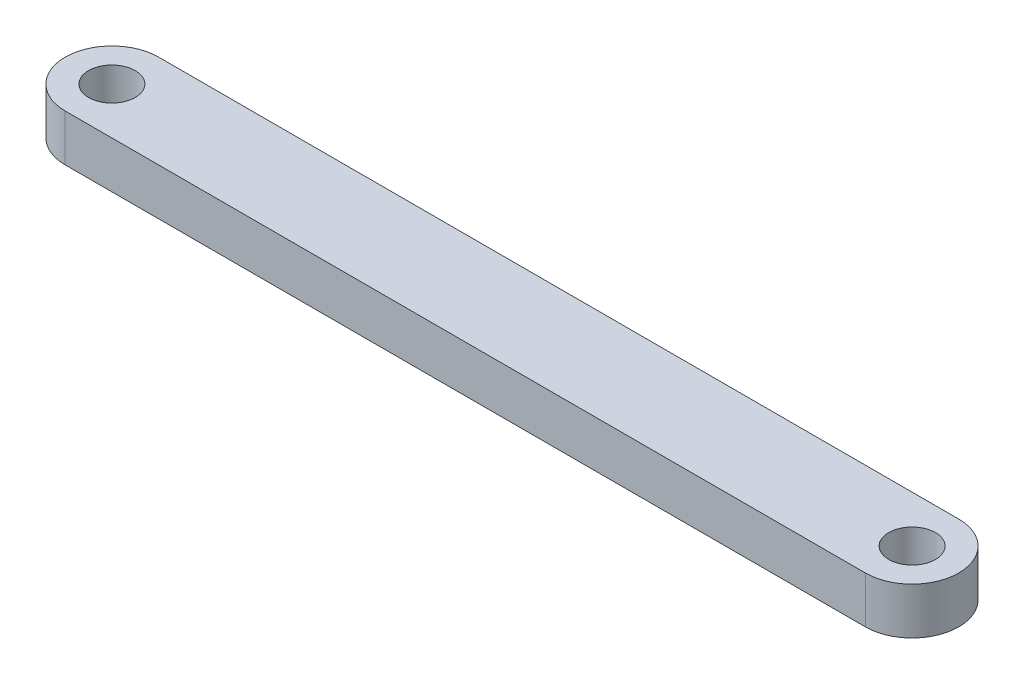
ISO-10303-21;
HEADER;
FILE_DESCRIPTION(('STEP AP214'),'2;1');
FILE_NAME('part.step','',(''),(''),'','','');
FILE_SCHEMA(('AUTOMOTIVE_DESIGN { 1 0 10303 214 1 1 1 1 }'));
ENDSEC;
DATA;
#1=APPLICATION_CONTEXT('core data for automotive mechanical design processes');
#2=APPLICATION_PROTOCOL_DEFINITION('international standard','automotive_design',2000,#1);
#3=PRODUCT_CONTEXT('',#1,'mechanical');
#4=PRODUCT('Part','Part','',(#3));
#5=PRODUCT_RELATED_PRODUCT_CATEGORY('part','',(#4));
#6=PRODUCT_DEFINITION_FORMATION('','',#4);
#7=PRODUCT_DEFINITION_CONTEXT('part definition',#1,'design');
#8=PRODUCT_DEFINITION('design','',#6,#7);
#9=PRODUCT_DEFINITION_SHAPE('','',#8);
#10=(LENGTH_UNIT() NAMED_UNIT(*) SI_UNIT(.MILLI.,.METRE.));
#11=(NAMED_UNIT(*) PLANE_ANGLE_UNIT() SI_UNIT($,.RADIAN.));
#12=(NAMED_UNIT(*) SI_UNIT($,.STERADIAN.) SOLID_ANGLE_UNIT());
#13=UNCERTAINTY_MEASURE_WITH_UNIT(LENGTH_MEASURE(1.E-05),#10,'distance_accuracy_value','');
#14=(GEOMETRIC_REPRESENTATION_CONTEXT(3) GLOBAL_UNCERTAINTY_ASSIGNED_CONTEXT((#13)) GLOBAL_UNIT_ASSIGNED_CONTEXT((#10,
#11,#12)) REPRESENTATION_CONTEXT('',''));
#15=CARTESIAN_POINT('',(0.,0.,0.));
#16=DIRECTION('',(0.,0.,1.));
#17=DIRECTION('',(1.,0.,0.));
#18=AXIS2_PLACEMENT_3D('',#15,#16,#17);
#19=CARTESIAN_POINT('',(-17.14,2.,0.));
#20=DIRECTION('',(0.,1.,0.));
#21=DIRECTION('',(0.,0.,1.));
#22=AXIS2_PLACEMENT_3D('',#19,#20,#21);
#23=PLANE('',#22);
#24=CARTESIAN_POINT('',(-17.14,2.,0.));
#25=DIRECTION('',(0.,1.,0.));
#26=DIRECTION('',(0.,0.,1.));
#27=AXIS2_PLACEMENT_3D('',#24,#25,#26);
#28=CIRCLE('',#27,1.);
#29=CARTESIAN_POINT('',(-17.14,2.,1.));
#30=VERTEX_POINT('',#29);
#31=EDGE_CURVE('E108',#30,#30,#28,.T.);
#32=ORIENTED_EDGE('',*,*,#31,.F.);
#33=EDGE_LOOP('',(#32));
#34=FACE_BOUND('',#33,.T.);
#35=CARTESIAN_POINT('',(-17.14,2.,0.));
#36=DIRECTION('',(0.,1.,0.));
#37=DIRECTION('',(0.,0.,1.));
#38=AXIS2_PLACEMENT_3D('',#35,#36,#37);
#39=CIRCLE('',#38,2.);
#40=CARTESIAN_POINT('',(-17.14,2.,-2.));
#41=VERTEX_POINT('',#40);
#42=CARTESIAN_POINT('',(-17.14,2.,2.00000000000001));
#43=VERTEX_POINT('',#42);
#44=EDGE_CURVE('E93',#41,#43,#39,.T.);
#45=ORIENTED_EDGE('',*,*,#44,.T.);
#46=DIRECTION('',(1.,0.,0.));
#47=VECTOR('',#46,1.);
#48=CARTESIAN_POINT('',(17.14,2.,2.));
#49=LINE('',#48,#47);
#50=CARTESIAN_POINT('',(17.14,2.,2.));
#51=VERTEX_POINT('',#50);
#52=EDGE_CURVE('E88',#43,#51,#49,.T.);
#53=ORIENTED_EDGE('',*,*,#52,.T.);
#54=CARTESIAN_POINT('',(17.14,2.,0.));
#55=DIRECTION('',(0.,1.,0.));
#56=DIRECTION('',(0.,0.,1.));
#57=AXIS2_PLACEMENT_3D('',#54,#55,#56);
#58=CIRCLE('',#57,2.);
#59=CARTESIAN_POINT('',(17.14,2.,-2.));
#60=VERTEX_POINT('',#59);
#61=EDGE_CURVE('E91',#51,#60,#58,.T.);
#62=ORIENTED_EDGE('',*,*,#61,.T.);
#63=DIRECTION('',(-1.,0.,0.));
#64=VECTOR('',#63,1.);
#65=CARTESIAN_POINT('',(-17.14,2.,-2.));
#66=LINE('',#65,#64);
#67=EDGE_CURVE('E58',#60,#41,#66,.T.);
#68=ORIENTED_EDGE('',*,*,#67,.T.);
#69=EDGE_LOOP('',(#45,#53,#62,#68));
#70=FACE_BOUND('',#69,.T.);
#71=CARTESIAN_POINT('',(17.14,2.,0.));
#72=DIRECTION('',(0.,1.,0.));
#73=DIRECTION('',(0.,0.,1.));
#74=AXIS2_PLACEMENT_3D('',#71,#72,#73);
#75=CIRCLE('',#74,1.);
#76=CARTESIAN_POINT('',(17.14,2.,1.));
#77=VERTEX_POINT('',#76);
#78=EDGE_CURVE('E123',#77,#77,#75,.T.);
#79=ORIENTED_EDGE('',*,*,#78,.F.);
#80=EDGE_LOOP('',(#79));
#81=FACE_BOUND('',#80,.T.);
#82=ADVANCED_FACE('F41',(#34,#70,#81),#23,.T.);
#83=CARTESIAN_POINT('',(-17.14,0.,0.));
#84=DIRECTION('',(0.,1.,0.));
#85=DIRECTION('',(0.,0.,1.));
#86=AXIS2_PLACEMENT_3D('',#83,#84,#85);
#87=PLANE('',#86);
#88=CARTESIAN_POINT('',(-17.14,0.,0.));
#89=DIRECTION('',(0.,1.,0.));
#90=DIRECTION('',(0.,0.,1.));
#91=AXIS2_PLACEMENT_3D('',#88,#89,#90);
#92=CIRCLE('',#91,2.);
#93=CARTESIAN_POINT('',(-17.14,0.,-2.));
#94=VERTEX_POINT('',#93);
#95=CARTESIAN_POINT('',(-17.14,0.,2.00000000000001));
#96=VERTEX_POINT('',#95);
#97=EDGE_CURVE('E105',#94,#96,#92,.T.);
#98=ORIENTED_EDGE('',*,*,#97,.F.);
#99=DIRECTION('',(-1.,0.,0.));
#100=VECTOR('',#99,1.);
#101=CARTESIAN_POINT('',(-17.14,0.,-2.));
#102=LINE('',#101,#100);
#103=CARTESIAN_POINT('',(17.14,0.,-2.));
#104=VERTEX_POINT('',#103);
#105=EDGE_CURVE('E81',#104,#94,#102,.T.);
#106=ORIENTED_EDGE('',*,*,#105,.F.);
#107=CARTESIAN_POINT('',(17.14,0.,0.));
#108=DIRECTION('',(0.,1.,0.));
#109=DIRECTION('',(0.,0.,1.));
#110=AXIS2_PLACEMENT_3D('',#107,#108,#109);
#111=CIRCLE('',#110,2.);
#112=CARTESIAN_POINT('',(17.14,0.,2.));
#113=VERTEX_POINT('',#112);
#114=EDGE_CURVE('E75',#113,#104,#111,.T.);
#115=ORIENTED_EDGE('',*,*,#114,.F.);
#116=DIRECTION('',(1.,0.,0.));
#117=VECTOR('',#116,1.);
#118=CARTESIAN_POINT('',(17.14,0.,2.));
#119=LINE('',#118,#117);
#120=EDGE_CURVE('E97',#96,#113,#119,.T.);
#121=ORIENTED_EDGE('',*,*,#120,.F.);
#122=EDGE_LOOP('',(#98,#106,#115,#121));
#123=FACE_BOUND('',#122,.T.);
#124=CARTESIAN_POINT('',(-17.14,0.,0.));
#125=DIRECTION('',(0.,1.,0.));
#126=DIRECTION('',(0.,0.,1.));
#127=AXIS2_PLACEMENT_3D('',#124,#125,#126);
#128=CIRCLE('',#127,1.);
#129=CARTESIAN_POINT('',(-17.14,0.,1.));
#130=VERTEX_POINT('',#129);
#131=EDGE_CURVE('E120',#130,#130,#128,.T.);
#132=ORIENTED_EDGE('',*,*,#131,.T.);
#133=EDGE_LOOP('',(#132));
#134=FACE_BOUND('',#133,.T.);
#135=CARTESIAN_POINT('',(17.14,0.,0.));
#136=DIRECTION('',(0.,1.,0.));
#137=DIRECTION('',(0.,0.,1.));
#138=AXIS2_PLACEMENT_3D('',#135,#136,#137);
#139=CIRCLE('',#138,1.);
#140=CARTESIAN_POINT('',(17.14,0.,1.));
#141=VERTEX_POINT('',#140);
#142=EDGE_CURVE('E126',#141,#141,#139,.T.);
#143=ORIENTED_EDGE('',*,*,#142,.T.);
#144=EDGE_LOOP('',(#143));
#145=FACE_BOUND('',#144,.T.);
#146=ADVANCED_FACE('F116',(#123,#134,#145),#87,.F.);
#147=CARTESIAN_POINT('',(-17.14,2.,0.));
#148=DIRECTION('',(0.,-1.,0.));
#149=DIRECTION('',(0.,0.,-1.));
#150=AXIS2_PLACEMENT_3D('',#147,#148,#149);
#151=CYLINDRICAL_SURFACE('',#150,2.);
#152=ORIENTED_EDGE('',*,*,#97,.T.);
#153=DIRECTION('',(0.,-1.,0.));
#154=VECTOR('',#153,1.);
#155=CARTESIAN_POINT('',(-17.14,2.,2.00000000000001));
#156=LINE('',#155,#154);
#157=EDGE_CURVE('E11',#43,#96,#156,.T.);
#158=ORIENTED_EDGE('',*,*,#157,.F.);
#159=ORIENTED_EDGE('',*,*,#44,.F.);
#160=DIRECTION('',(0.,-1.,0.));
#161=VECTOR('',#160,1.);
#162=CARTESIAN_POINT('',(-17.14,2.,-2.));
#163=LINE('',#162,#161);
#164=EDGE_CURVE('E101',#41,#94,#163,.T.);
#165=ORIENTED_EDGE('',*,*,#164,.T.);
#166=EDGE_LOOP('',(#152,#158,#159,#165));
#167=FACE_BOUND('',#166,.T.);
#168=ADVANCED_FACE('F43',(#167),#151,.T.);
#169=CARTESIAN_POINT('',(17.14,2.,2.));
#170=DIRECTION('',(0.,0.,-1.));
#171=DIRECTION('',(-1.,0.,0.));
#172=AXIS2_PLACEMENT_3D('',#169,#170,#171);
#173=PLANE('',#172);
#174=ORIENTED_EDGE('',*,*,#120,.T.);
#175=DIRECTION('',(0.,-1.,0.));
#176=VECTOR('',#175,1.);
#177=CARTESIAN_POINT('',(17.14,2.,2.));
#178=LINE('',#177,#176);
#179=EDGE_CURVE('E50',#51,#113,#178,.T.);
#180=ORIENTED_EDGE('',*,*,#179,.F.);
#181=ORIENTED_EDGE('',*,*,#52,.F.);
#182=ORIENTED_EDGE('',*,*,#157,.T.);
#183=EDGE_LOOP('',(#174,#180,#181,#182));
#184=FACE_BOUND('',#183,.T.);
#185=ADVANCED_FACE('F96',(#184),#173,.F.);
#186=CARTESIAN_POINT('',(17.14,2.,0.));
#187=DIRECTION('',(0.,-1.,0.));
#188=DIRECTION('',(0.,0.,-1.));
#189=AXIS2_PLACEMENT_3D('',#186,#187,#188);
#190=CYLINDRICAL_SURFACE('',#189,2.);
#191=ORIENTED_EDGE('',*,*,#114,.T.);
#192=DIRECTION('',(0.,-1.,0.));
#193=VECTOR('',#192,1.);
#194=CARTESIAN_POINT('',(17.14,2.,-2.));
#195=LINE('',#194,#193);
#196=EDGE_CURVE('E98',#60,#104,#195,.T.);
#197=ORIENTED_EDGE('',*,*,#196,.F.);
#198=ORIENTED_EDGE('',*,*,#61,.F.);
#199=ORIENTED_EDGE('',*,*,#179,.T.);
#200=EDGE_LOOP('',(#191,#197,#198,#199));
#201=FACE_BOUND('',#200,.T.);
#202=ADVANCED_FACE('F99',(#201),#190,.T.);
#203=CARTESIAN_POINT('',(-17.14,2.,-2.));
#204=DIRECTION('',(0.,0.,1.));
#205=DIRECTION('',(1.,0.,0.));
#206=AXIS2_PLACEMENT_3D('',#203,#204,#205);
#207=PLANE('',#206);
#208=ORIENTED_EDGE('',*,*,#105,.T.);
#209=ORIENTED_EDGE('',*,*,#164,.F.);
#210=ORIENTED_EDGE('',*,*,#67,.F.);
#211=ORIENTED_EDGE('',*,*,#196,.T.);
#212=EDGE_LOOP('',(#208,#209,#210,#211));
#213=FACE_BOUND('',#212,.T.);
#214=ADVANCED_FACE('F113',(#213),#207,.F.);
#215=CARTESIAN_POINT('',(-17.14,2.,0.));
#216=DIRECTION('',(0.,-1.,0.));
#217=DIRECTION('',(0.,0.,-1.));
#218=AXIS2_PLACEMENT_3D('',#215,#216,#217);
#219=CYLINDRICAL_SURFACE('',#218,1.);
#220=ORIENTED_EDGE('',*,*,#31,.T.);
#221=EDGE_LOOP('',(#220));
#222=FACE_BOUND('',#221,.T.);
#223=ORIENTED_EDGE('',*,*,#131,.F.);
#224=EDGE_LOOP('',(#223));
#225=FACE_BOUND('',#224,.T.);
#226=ADVANCED_FACE('F143',(#222,#225),#219,.F.);
#227=CARTESIAN_POINT('',(17.14,2.,0.));
#228=DIRECTION('',(0.,-1.,0.));
#229=DIRECTION('',(0.,0.,-1.));
#230=AXIS2_PLACEMENT_3D('',#227,#228,#229);
#231=CYLINDRICAL_SURFACE('',#230,1.);
#232=ORIENTED_EDGE('',*,*,#78,.T.);
#233=EDGE_LOOP('',(#232));
#234=FACE_BOUND('',#233,.T.);
#235=ORIENTED_EDGE('',*,*,#142,.F.);
#236=EDGE_LOOP('',(#235));
#237=FACE_BOUND('',#236,.T.);
#238=ADVANCED_FACE('F132',(#234,#237),#231,.F.);
#239=CLOSED_SHELL('',(#82,#146,#168,#185,#202,#214,#226,#238));
#240=MANIFOLD_SOLID_BREP('B2',#239);
#241=ADVANCED_BREP_SHAPE_REPRESENTATION('',(#18,#240),#14);
#242=SHAPE_DEFINITION_REPRESENTATION(#9,#241);
ENDSEC;
END-ISO-10303-21;
